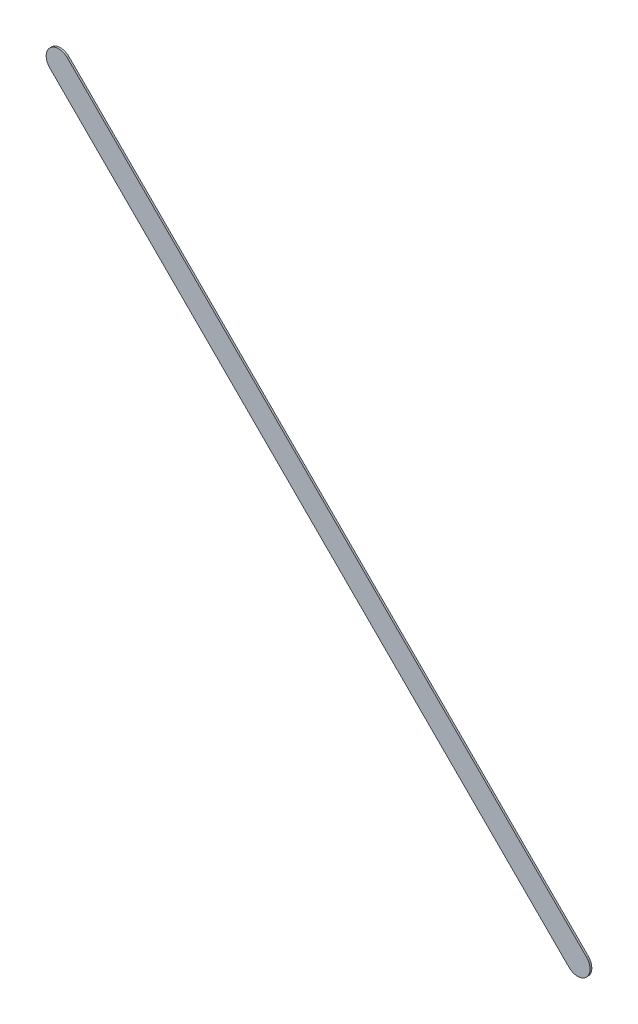
ISO-10303-21;
HEADER;
FILE_DESCRIPTION(('STEP AP214'),'2;1');
FILE_NAME('part.step','',(''),(''),'','','');
FILE_SCHEMA(('AUTOMOTIVE_DESIGN { 1 0 10303 214 1 1 1 1 }'));
ENDSEC;
DATA;
#1=APPLICATION_CONTEXT('core data for automotive mechanical design processes');
#2=APPLICATION_PROTOCOL_DEFINITION('international standard','automotive_design',2000,#1);
#3=PRODUCT_CONTEXT('',#1,'mechanical');
#4=PRODUCT('Part','Part','',(#3));
#5=PRODUCT_RELATED_PRODUCT_CATEGORY('part','',(#4));
#6=PRODUCT_DEFINITION_FORMATION('','',#4);
#7=PRODUCT_DEFINITION_CONTEXT('part definition',#1,'design');
#8=PRODUCT_DEFINITION('design','',#6,#7);
#9=PRODUCT_DEFINITION_SHAPE('','',#8);
#10=(LENGTH_UNIT() NAMED_UNIT(*) SI_UNIT(.MILLI.,.METRE.));
#11=(NAMED_UNIT(*) PLANE_ANGLE_UNIT() SI_UNIT($,.RADIAN.));
#12=(NAMED_UNIT(*) SI_UNIT($,.STERADIAN.) SOLID_ANGLE_UNIT());
#13=UNCERTAINTY_MEASURE_WITH_UNIT(LENGTH_MEASURE(1.E-05),#10,'distance_accuracy_value','');
#14=(GEOMETRIC_REPRESENTATION_CONTEXT(3) GLOBAL_UNCERTAINTY_ASSIGNED_CONTEXT((#13)) GLOBAL_UNIT_ASSIGNED_CONTEXT((#10,
#11,#12)) REPRESENTATION_CONTEXT('',''));
#15=CARTESIAN_POINT('',(0.,0.,0.));
#16=DIRECTION('',(0.,0.,1.));
#17=DIRECTION('',(1.,0.,0.));
#18=AXIS2_PLACEMENT_3D('',#15,#16,#17);
#19=CARTESIAN_POINT('',(103.7232241,89.82322396,0.));
#20=DIRECTION('',(0.707106781186547,0.707106781186548,0.));
#21=DIRECTION('',(0.707106781186548,-0.707106781186547,0.));
#22=AXIS2_PLACEMENT_3D('',#19,#20,#21);
#23=PLANE('',#22);
#24=DIRECTION('',(0.707106781186548,-0.707106781186547,0.));
#25=VECTOR('',#24,1.);
#26=CARTESIAN_POINT('',(103.7232241,89.82322396,0.03556));
#27=LINE('',#26,#25);
#28=CARTESIAN_POINT('',(103.7232241,89.82322396,0.03556));
#29=VERTEX_POINT('',#28);
#30=CARTESIAN_POINT('',(114.16321084,79.38323722,0.03556));
#31=VERTEX_POINT('',#30);
#32=EDGE_CURVE('E11',#29,#31,#27,.T.);
#33=ORIENTED_EDGE('',*,*,#32,.F.);
#34=DIRECTION('',(0.,0.,1.));
#35=VECTOR('',#34,1.);
#36=CARTESIAN_POINT('',(103.7232241,89.82322396,0.));
#37=LINE('',#36,#35);
#38=CARTESIAN_POINT('',(103.7232241,89.82322396,0.));
#39=VERTEX_POINT('',#38);
#40=EDGE_CURVE('E24',#39,#29,#37,.T.);
#41=ORIENTED_EDGE('',*,*,#40,.F.);
#42=DIRECTION('',(0.707106781186548,-0.707106781186547,0.));
#43=VECTOR('',#42,1.);
#44=CARTESIAN_POINT('',(103.7232241,89.82322396,0.));
#45=LINE('',#44,#43);
#46=CARTESIAN_POINT('',(114.16321084,79.38323722,0.));
#47=VERTEX_POINT('',#46);
#48=EDGE_CURVE('E75',#39,#47,#45,.T.);
#49=ORIENTED_EDGE('',*,*,#48,.T.);
#50=DIRECTION('',(0.,0.,1.));
#51=VECTOR('',#50,1.);
#52=CARTESIAN_POINT('',(114.16321084,79.38323722,0.));
#53=LINE('',#52,#51);
#54=EDGE_CURVE('E37',#47,#31,#53,.T.);
#55=ORIENTED_EDGE('',*,*,#54,.T.);
#56=EDGE_LOOP('',(#33,#41,#49,#55));
#57=FACE_BOUND('',#56,.T.);
#58=ADVANCED_FACE('F17',(#57),#23,.F.);
#59=CARTESIAN_POINT('',(114.33998722,79.5600136,0.));
#60=DIRECTION('',(0.,0.,-1.));
#61=DIRECTION('',(-0.707106781186548,-0.707106781186548,0.));
#62=AXIS2_PLACEMENT_3D('',#59,#60,#61);
#63=CYLINDRICAL_SURFACE('',#62,0.249999554103213);
#64=CARTESIAN_POINT('',(114.33998722,79.5600136,0.03556));
#65=DIRECTION('',(0.,0.,1.));
#66=DIRECTION('',(-0.707106781186548,-0.707106781186548,0.));
#67=AXIS2_PLACEMENT_3D('',#64,#65,#66);
#68=CIRCLE('',#67,0.249999554103213);
#69=CARTESIAN_POINT('',(114.5167636,79.73678998,0.03556));
#70=VERTEX_POINT('',#69);
#71=EDGE_CURVE('E83',#31,#70,#68,.T.);
#72=ORIENTED_EDGE('',*,*,#71,.F.);
#73=ORIENTED_EDGE('',*,*,#54,.F.);
#74=CARTESIAN_POINT('',(114.33998722,79.5600136,0.));
#75=DIRECTION('',(0.,0.,1.));
#76=DIRECTION('',(-0.707106781186548,-0.707106781186548,0.));
#77=AXIS2_PLACEMENT_3D('',#74,#75,#76);
#78=CIRCLE('',#77,0.249999554103213);
#79=CARTESIAN_POINT('',(114.5167636,79.73678998,0.));
#80=VERTEX_POINT('',#79);
#81=EDGE_CURVE('E81',#47,#80,#78,.T.);
#82=ORIENTED_EDGE('',*,*,#81,.T.);
#83=DIRECTION('',(0.,0.,1.));
#84=VECTOR('',#83,1.);
#85=CARTESIAN_POINT('',(114.5167636,79.73678998,0.));
#86=LINE('',#85,#84);
#87=EDGE_CURVE('E67',#80,#70,#86,.T.);
#88=ORIENTED_EDGE('',*,*,#87,.T.);
#89=EDGE_LOOP('',(#72,#73,#82,#88));
#90=FACE_BOUND('',#89,.T.);
#91=ADVANCED_FACE('F89',(#90),#63,.T.);
#92=CARTESIAN_POINT('',(114.5167636,79.73678998,0.));
#93=DIRECTION('',(-0.707106781186548,-0.707106781186547,0.));
#94=DIRECTION('',(-0.707106781186547,0.707106781186548,0.));
#95=AXIS2_PLACEMENT_3D('',#92,#93,#94);
#96=PLANE('',#95);
#97=DIRECTION('',(-0.707106781186547,0.707106781186548,0.));
#98=VECTOR('',#97,1.);
#99=CARTESIAN_POINT('',(114.5167636,79.73678998,0.03556));
#100=LINE('',#99,#98);
#101=CARTESIAN_POINT('',(104.07677686,90.17677672,0.03556));
#102=VERTEX_POINT('',#101);
#103=EDGE_CURVE('E71',#70,#102,#100,.T.);
#104=ORIENTED_EDGE('',*,*,#103,.F.);
#105=ORIENTED_EDGE('',*,*,#87,.F.);
#106=DIRECTION('',(-0.707106781186547,0.707106781186548,0.));
#107=VECTOR('',#106,1.);
#108=CARTESIAN_POINT('',(114.5167636,79.73678998,0.));
#109=LINE('',#108,#107);
#110=CARTESIAN_POINT('',(104.07677686,90.17677672,0.));
#111=VERTEX_POINT('',#110);
#112=EDGE_CURVE('E63',#80,#111,#109,.T.);
#113=ORIENTED_EDGE('',*,*,#112,.T.);
#114=DIRECTION('',(0.,0.,1.));
#115=VECTOR('',#114,1.);
#116=CARTESIAN_POINT('',(104.07677686,90.17677672,0.));
#117=LINE('',#116,#115);
#118=EDGE_CURVE('E53',#111,#102,#117,.T.);
#119=ORIENTED_EDGE('',*,*,#118,.T.);
#120=EDGE_LOOP('',(#104,#105,#113,#119));
#121=FACE_BOUND('',#120,.T.);
#122=ADVANCED_FACE('F66',(#121),#96,.F.);
#123=CARTESIAN_POINT('',(103.90000048,90.00000034,0.));
#124=DIRECTION('',(0.,0.,-1.));
#125=DIRECTION('',(0.707106781186548,0.707106781186548,0.));
#126=AXIS2_PLACEMENT_3D('',#123,#124,#125);
#127=CYLINDRICAL_SURFACE('',#126,0.249999554103223);
#128=CARTESIAN_POINT('',(103.90000048,90.00000034,0.03556));
#129=DIRECTION('',(0.,0.,1.));
#130=DIRECTION('',(0.707106781186548,0.707106781186548,0.));
#131=AXIS2_PLACEMENT_3D('',#128,#129,#130);
#132=CIRCLE('',#131,0.249999554103223);
#133=EDGE_CURVE('E59',#102,#29,#132,.T.);
#134=ORIENTED_EDGE('',*,*,#133,.F.);
#135=ORIENTED_EDGE('',*,*,#118,.F.);
#136=CARTESIAN_POINT('',(103.90000048,90.00000034,0.));
#137=DIRECTION('',(0.,0.,1.));
#138=DIRECTION('',(0.707106781186548,0.707106781186548,0.));
#139=AXIS2_PLACEMENT_3D('',#136,#137,#138);
#140=CIRCLE('',#139,0.249999554103223);
#141=EDGE_CURVE('E57',#111,#39,#140,.T.);
#142=ORIENTED_EDGE('',*,*,#141,.T.);
#143=ORIENTED_EDGE('',*,*,#40,.T.);
#144=EDGE_LOOP('',(#134,#135,#142,#143));
#145=FACE_BOUND('',#144,.T.);
#146=ADVANCED_FACE('F55',(#145),#127,.T.);
#147=CARTESIAN_POINT('',(103.7232241,89.82322396,0.));
#148=DIRECTION('',(0.,0.,-1.));
#149=DIRECTION('',(-1.,0.,0.));
#150=AXIS2_PLACEMENT_3D('',#147,#148,#149);
#151=PLANE('',#150);
#152=ORIENTED_EDGE('',*,*,#141,.F.);
#153=ORIENTED_EDGE('',*,*,#112,.F.);
#154=ORIENTED_EDGE('',*,*,#81,.F.);
#155=ORIENTED_EDGE('',*,*,#48,.F.);
#156=EDGE_LOOP('',(#152,#153,#154,#155));
#157=FACE_BOUND('',#156,.T.);
#158=ADVANCED_FACE('F74',(#157),#151,.T.);
#159=CARTESIAN_POINT('',(103.7232241,89.82322396,0.03556));
#160=DIRECTION('',(0.,0.,-1.));
#161=DIRECTION('',(-1.,0.,0.));
#162=AXIS2_PLACEMENT_3D('',#159,#160,#161);
#163=PLANE('',#162);
#164=ORIENTED_EDGE('',*,*,#32,.T.);
#165=ORIENTED_EDGE('',*,*,#71,.T.);
#166=ORIENTED_EDGE('',*,*,#103,.T.);
#167=ORIENTED_EDGE('',*,*,#133,.T.);
#168=EDGE_LOOP('',(#164,#165,#166,#167));
#169=FACE_BOUND('',#168,.T.);
#170=ADVANCED_FACE('F91',(#169),#163,.F.);
#171=CLOSED_SHELL('',(#58,#91,#122,#146,#158,#170));
#172=MANIFOLD_SOLID_BREP('B1',#171);
#173=ADVANCED_BREP_SHAPE_REPRESENTATION('',(#18,#172),#14);
#174=SHAPE_DEFINITION_REPRESENTATION(#9,#173);
ENDSEC;
END-ISO-10303-21;
